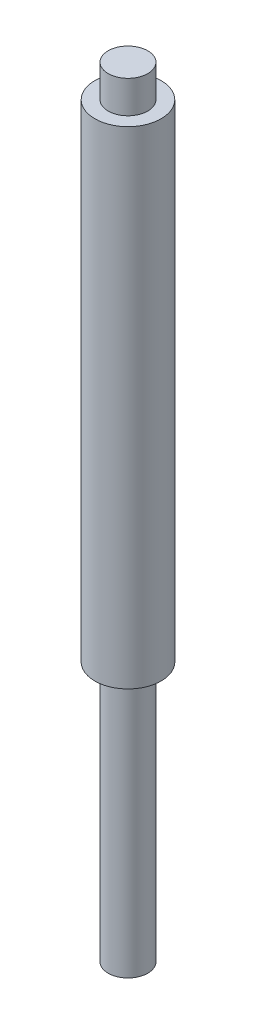
ISO-10303-21;
HEADER;
FILE_DESCRIPTION(('STEP AP214'),'2;1');
FILE_NAME('part.step','',(''),(''),'','','');
FILE_SCHEMA(('AUTOMOTIVE_DESIGN { 1 0 10303 214 1 1 1 1 }'));
ENDSEC;
DATA;
#1=APPLICATION_CONTEXT('core data for automotive mechanical design processes');
#2=APPLICATION_PROTOCOL_DEFINITION('international standard','automotive_design',2000,#1);
#3=PRODUCT_CONTEXT('',#1,'mechanical');
#4=PRODUCT('Part','Part','',(#3));
#5=PRODUCT_RELATED_PRODUCT_CATEGORY('part','',(#4));
#6=PRODUCT_DEFINITION_FORMATION('','',#4);
#7=PRODUCT_DEFINITION_CONTEXT('part definition',#1,'design');
#8=PRODUCT_DEFINITION('design','',#6,#7);
#9=PRODUCT_DEFINITION_SHAPE('','',#8);
#10=(LENGTH_UNIT() NAMED_UNIT(*) SI_UNIT(.MILLI.,.METRE.));
#11=(NAMED_UNIT(*) PLANE_ANGLE_UNIT() SI_UNIT($,.RADIAN.));
#12=(NAMED_UNIT(*) SI_UNIT($,.STERADIAN.) SOLID_ANGLE_UNIT());
#13=UNCERTAINTY_MEASURE_WITH_UNIT(LENGTH_MEASURE(1.E-05),#10,'distance_accuracy_value','');
#14=(GEOMETRIC_REPRESENTATION_CONTEXT(3) GLOBAL_UNCERTAINTY_ASSIGNED_CONTEXT((#13)) GLOBAL_UNIT_ASSIGNED_CONTEXT((#10,
#11,#12)) REPRESENTATION_CONTEXT('',''));
#15=CARTESIAN_POINT('',(0.,0.,0.));
#16=DIRECTION('',(0.,0.,1.));
#17=DIRECTION('',(1.,0.,0.));
#18=AXIS2_PLACEMENT_3D('',#15,#16,#17);
#19=CARTESIAN_POINT('',(0.,15.,0.));
#20=DIRECTION('',(0.,1.,0.));
#21=DIRECTION('',(0.,0.,1.));
#22=AXIS2_PLACEMENT_3D('',#19,#20,#21);
#23=PLANE('',#22);
#24=CARTESIAN_POINT('',(0.,15.,0.));
#25=DIRECTION('',(0.,1.,0.));
#26=DIRECTION('',(0.,0.,1.));
#27=AXIS2_PLACEMENT_3D('',#24,#25,#26);
#28=CIRCLE('',#27,1.02);
#29=CARTESIAN_POINT('',(0.,15.,1.02));
#30=VERTEX_POINT('',#29);
#31=EDGE_CURVE('E44',#30,#30,#28,.T.);
#32=ORIENTED_EDGE('',*,*,#31,.T.);
#33=EDGE_LOOP('',(#32));
#34=FACE_BOUND('',#33,.T.);
#35=CARTESIAN_POINT('',(0.,15.,0.));
#36=DIRECTION('',(0.,1.,0.));
#37=DIRECTION('',(0.,0.,1.));
#38=AXIS2_PLACEMENT_3D('',#35,#36,#37);
#39=CIRCLE('',#38,0.61);
#40=CARTESIAN_POINT('',(0.,15.,0.61));
#41=VERTEX_POINT('',#40);
#42=EDGE_CURVE('E52',#41,#41,#39,.T.);
#43=ORIENTED_EDGE('',*,*,#42,.F.);
#44=EDGE_LOOP('',(#43));
#45=FACE_BOUND('',#44,.T.);
#46=ADVANCED_FACE('F33',(#34,#45),#23,.T.);
#47=CARTESIAN_POINT('',(0.,-8.,0.));
#48=DIRECTION('',(0.,1.,0.));
#49=DIRECTION('',(0.,0.,1.));
#50=AXIS2_PLACEMENT_3D('',#47,#48,#49);
#51=CYLINDRICAL_SURFACE('',#50,0.61);
#52=CARTESIAN_POINT('',(0.,-8.,0.));
#53=DIRECTION('',(0.,1.,0.));
#54=DIRECTION('',(0.,0.,1.));
#55=AXIS2_PLACEMENT_3D('',#52,#53,#54);
#56=CIRCLE('',#55,0.61);
#57=CARTESIAN_POINT('',(0.,-8.,0.61));
#58=VERTEX_POINT('',#57);
#59=EDGE_CURVE('E10',#58,#58,#56,.T.);
#60=ORIENTED_EDGE('',*,*,#59,.T.);
#61=EDGE_LOOP('',(#60));
#62=FACE_BOUND('',#61,.T.);
#63=CARTESIAN_POINT('',(0.,0.,0.));
#64=DIRECTION('',(0.,1.,0.));
#65=DIRECTION('',(0.,0.,1.));
#66=AXIS2_PLACEMENT_3D('',#63,#64,#65);
#67=CIRCLE('',#66,0.61);
#68=CARTESIAN_POINT('',(0.,0.,0.61));
#69=VERTEX_POINT('',#68);
#70=EDGE_CURVE('E37',#69,#69,#67,.T.);
#71=ORIENTED_EDGE('',*,*,#70,.F.);
#72=EDGE_LOOP('',(#71));
#73=FACE_BOUND('',#72,.T.);
#74=ADVANCED_FACE('F35',(#62,#73),#51,.T.);
#75=CARTESIAN_POINT('',(0.,-8.,0.));
#76=DIRECTION('',(0.,1.,0.));
#77=DIRECTION('',(0.,0.,1.));
#78=AXIS2_PLACEMENT_3D('',#75,#76,#77);
#79=PLANE('',#78);
#80=ORIENTED_EDGE('',*,*,#59,.F.);
#81=EDGE_LOOP('',(#80));
#82=FACE_BOUND('',#81,.T.);
#83=ADVANCED_FACE('F73',(#82),#79,.F.);
#84=CARTESIAN_POINT('',(0.,15.,0.));
#85=DIRECTION('',(0.,-1.,0.));
#86=DIRECTION('',(0.,0.,-1.));
#87=AXIS2_PLACEMENT_3D('',#84,#85,#86);
#88=CYLINDRICAL_SURFACE('',#87,1.02);
#89=ORIENTED_EDGE('',*,*,#31,.F.);
#90=EDGE_LOOP('',(#89));
#91=FACE_BOUND('',#90,.T.);
#92=CARTESIAN_POINT('',(0.,0.,0.));
#93=DIRECTION('',(0.,1.,0.));
#94=DIRECTION('',(0.,0.,1.));
#95=AXIS2_PLACEMENT_3D('',#92,#93,#94);
#96=CIRCLE('',#95,1.02);
#97=CARTESIAN_POINT('',(0.,0.,1.02));
#98=VERTEX_POINT('',#97);
#99=EDGE_CURVE('E46',#98,#98,#96,.T.);
#100=ORIENTED_EDGE('',*,*,#99,.T.);
#101=EDGE_LOOP('',(#100));
#102=FACE_BOUND('',#101,.T.);
#103=ADVANCED_FACE('F78',(#91,#102),#88,.T.);
#104=CARTESIAN_POINT('',(0.,0.,0.));
#105=DIRECTION('',(0.,1.,0.));
#106=DIRECTION('',(0.,0.,1.));
#107=AXIS2_PLACEMENT_3D('',#104,#105,#106);
#108=PLANE('',#107);
#109=ORIENTED_EDGE('',*,*,#70,.T.);
#110=EDGE_LOOP('',(#109));
#111=FACE_BOUND('',#110,.T.);
#112=ORIENTED_EDGE('',*,*,#99,.F.);
#113=EDGE_LOOP('',(#112));
#114=FACE_BOUND('',#113,.T.);
#115=ADVANCED_FACE('F63',(#111,#114),#108,.F.);
#116=CARTESIAN_POINT('',(0.,16.,0.));
#117=DIRECTION('',(0.,-1.,0.));
#118=DIRECTION('',(0.,0.,-1.));
#119=AXIS2_PLACEMENT_3D('',#116,#117,#118);
#120=CYLINDRICAL_SURFACE('',#119,0.61);
#121=CARTESIAN_POINT('',(0.,16.,0.));
#122=DIRECTION('',(0.,1.,0.));
#123=DIRECTION('',(0.,0.,1.));
#124=AXIS2_PLACEMENT_3D('',#121,#122,#123);
#125=CIRCLE('',#124,0.61);
#126=CARTESIAN_POINT('',(0.,16.,0.61));
#127=VERTEX_POINT('',#126);
#128=EDGE_CURVE('E49',#127,#127,#125,.T.);
#129=ORIENTED_EDGE('',*,*,#128,.F.);
#130=EDGE_LOOP('',(#129));
#131=FACE_BOUND('',#130,.T.);
#132=ORIENTED_EDGE('',*,*,#42,.T.);
#133=EDGE_LOOP('',(#132));
#134=FACE_BOUND('',#133,.T.);
#135=ADVANCED_FACE('F60',(#131,#134),#120,.T.);
#136=CARTESIAN_POINT('',(0.,16.,0.));
#137=DIRECTION('',(0.,1.,0.));
#138=DIRECTION('',(0.,0.,1.));
#139=AXIS2_PLACEMENT_3D('',#136,#137,#138);
#140=PLANE('',#139);
#141=ORIENTED_EDGE('',*,*,#128,.T.);
#142=EDGE_LOOP('',(#141));
#143=FACE_BOUND('',#142,.T.);
#144=ADVANCED_FACE('F58',(#143),#140,.T.);
#145=CLOSED_SHELL('',(#46,#74,#83,#103,#115,#135,#144));
#146=MANIFOLD_SOLID_BREP('B2',#145);
#147=ADVANCED_BREP_SHAPE_REPRESENTATION('',(#18,#146),#14);
#148=SHAPE_DEFINITION_REPRESENTATION(#9,#147);
ENDSEC;
END-ISO-10303-21;
